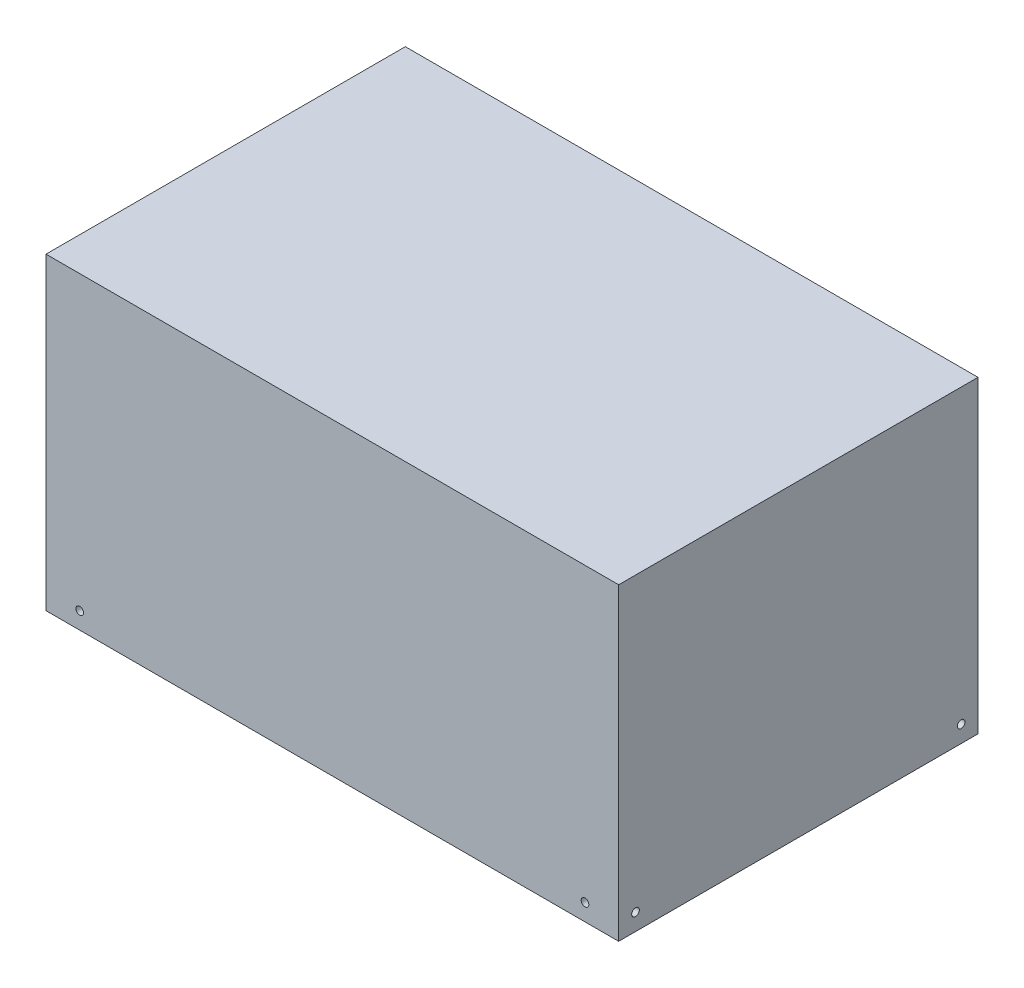
ISO-10303-21;
HEADER;
FILE_DESCRIPTION(('STEP AP214'),'2;1');
FILE_NAME('part.step','',(''),(''),'','','');
FILE_SCHEMA(('AUTOMOTIVE_DESIGN { 1 0 10303 214 1 1 1 1 }'));
ENDSEC;
DATA;
#1=APPLICATION_CONTEXT('core data for automotive mechanical design processes');
#2=APPLICATION_PROTOCOL_DEFINITION('international standard','automotive_design',2000,#1);
#3=PRODUCT_CONTEXT('',#1,'mechanical');
#4=PRODUCT('Part','Part','',(#3));
#5=PRODUCT_RELATED_PRODUCT_CATEGORY('part','',(#4));
#6=PRODUCT_DEFINITION_FORMATION('','',#4);
#7=PRODUCT_DEFINITION_CONTEXT('part definition',#1,'design');
#8=PRODUCT_DEFINITION('design','',#6,#7);
#9=PRODUCT_DEFINITION_SHAPE('','',#8);
#10=(LENGTH_UNIT() NAMED_UNIT(*) SI_UNIT(.MILLI.,.METRE.));
#11=(NAMED_UNIT(*) PLANE_ANGLE_UNIT() SI_UNIT($,.RADIAN.));
#12=(NAMED_UNIT(*) SI_UNIT($,.STERADIAN.) SOLID_ANGLE_UNIT());
#13=UNCERTAINTY_MEASURE_WITH_UNIT(LENGTH_MEASURE(1.E-05),#10,'distance_accuracy_value','');
#14=(GEOMETRIC_REPRESENTATION_CONTEXT(3) GLOBAL_UNCERTAINTY_ASSIGNED_CONTEXT((#13)) GLOBAL_UNIT_ASSIGNED_CONTEXT((#10,
#11,#12)) REPRESENTATION_CONTEXT('',''));
#15=CARTESIAN_POINT('',(0.,0.,0.));
#16=DIRECTION('',(0.,0.,1.));
#17=DIRECTION('',(1.,0.,0.));
#18=AXIS2_PLACEMENT_3D('',#15,#16,#17);
#19=CARTESIAN_POINT('',(255.,137.5,160.));
#20=DIRECTION('',(-1.,0.,0.));
#21=DIRECTION('',(0.,0.,1.));
#22=AXIS2_PLACEMENT_3D('',#19,#20,#21);
#23=PLANE('',#22);
#24=CARTESIAN_POINT('',(255.,-122.5,145.));
#25=DIRECTION('',(1.,0.,0.));
#26=DIRECTION('',(0.,0.,-1.));
#27=AXIS2_PLACEMENT_3D('',#24,#25,#26);
#28=CIRCLE('',#27,3.39999999999999);
#29=CARTESIAN_POINT('',(255.,-122.5,141.6));
#30=VERTEX_POINT('',#29);
#31=EDGE_CURVE('E128',#30,#30,#28,.T.);
#32=ORIENTED_EDGE('',*,*,#31,.F.);
#33=EDGE_LOOP('',(#32));
#34=FACE_BOUND('',#33,.T.);
#35=CARTESIAN_POINT('',(255.,-122.5,-145.));
#36=DIRECTION('',(1.,0.,0.));
#37=DIRECTION('',(0.,0.,-1.));
#38=AXIS2_PLACEMENT_3D('',#35,#36,#37);
#39=CIRCLE('',#38,3.39999999999999);
#40=CARTESIAN_POINT('',(255.,-122.5,-148.4));
#41=VERTEX_POINT('',#40);
#42=EDGE_CURVE('E134',#41,#41,#39,.T.);
#43=ORIENTED_EDGE('',*,*,#42,.F.);
#44=EDGE_LOOP('',(#43));
#45=FACE_BOUND('',#44,.T.);
#46=DIRECTION('',(0.,1.,0.));
#47=VECTOR('',#46,1.);
#48=CARTESIAN_POINT('',(255.,137.5,-160.));
#49=LINE('',#48,#47);
#50=CARTESIAN_POINT('',(255.,-137.5,-160.));
#51=VERTEX_POINT('',#50);
#52=CARTESIAN_POINT('',(255.,137.5,-160.));
#53=VERTEX_POINT('',#52);
#54=EDGE_CURVE('E152',#51,#53,#49,.T.);
#55=ORIENTED_EDGE('',*,*,#54,.T.);
#56=DIRECTION('',(0.,0.,-1.));
#57=VECTOR('',#56,1.);
#58=CARTESIAN_POINT('',(255.,137.5,160.));
#59=LINE('',#58,#57);
#60=CARTESIAN_POINT('',(255.,137.5,160.));
#61=VERTEX_POINT('',#60);
#62=EDGE_CURVE('E11',#61,#53,#59,.T.);
#63=ORIENTED_EDGE('',*,*,#62,.F.);
#64=DIRECTION('',(0.,1.,0.));
#65=VECTOR('',#64,1.);
#66=CARTESIAN_POINT('',(255.,137.5,160.));
#67=LINE('',#66,#65);
#68=CARTESIAN_POINT('',(255.,-137.5,160.));
#69=VERTEX_POINT('',#68);
#70=EDGE_CURVE('E153',#69,#61,#67,.T.);
#71=ORIENTED_EDGE('',*,*,#70,.F.);
#72=DIRECTION('',(0.,0.,-1.));
#73=VECTOR('',#72,1.);
#74=CARTESIAN_POINT('',(255.,-137.5,160.));
#75=LINE('',#74,#73);
#76=EDGE_CURVE('E159',#69,#51,#75,.T.);
#77=ORIENTED_EDGE('',*,*,#76,.T.);
#78=EDGE_LOOP('',(#55,#63,#71,#77));
#79=FACE_BOUND('',#78,.T.);
#80=ADVANCED_FACE('F41',(#34,#45,#79),#23,.F.);
#81=CARTESIAN_POINT('',(-255.,137.5,160.));
#82=DIRECTION('',(0.,-1.,0.));
#83=DIRECTION('',(0.,0.,-1.));
#84=AXIS2_PLACEMENT_3D('',#81,#82,#83);
#85=PLANE('',#84);
#86=DIRECTION('',(-1.,0.,0.));
#87=VECTOR('',#86,1.);
#88=CARTESIAN_POINT('',(-255.,137.5,-160.));
#89=LINE('',#88,#87);
#90=CARTESIAN_POINT('',(-255.,137.5,-160.));
#91=VERTEX_POINT('',#90);
#92=EDGE_CURVE('E162',#53,#91,#89,.T.);
#93=ORIENTED_EDGE('',*,*,#92,.T.);
#94=DIRECTION('',(0.,0.,-1.));
#95=VECTOR('',#94,1.);
#96=CARTESIAN_POINT('',(-255.,137.5,160.));
#97=LINE('',#96,#95);
#98=CARTESIAN_POINT('',(-255.,137.5,160.));
#99=VERTEX_POINT('',#98);
#100=EDGE_CURVE('E49',#99,#91,#97,.T.);
#101=ORIENTED_EDGE('',*,*,#100,.F.);
#102=DIRECTION('',(-1.,0.,0.));
#103=VECTOR('',#102,1.);
#104=CARTESIAN_POINT('',(-255.,137.5,160.));
#105=LINE('',#104,#103);
#106=EDGE_CURVE('E88',#61,#99,#105,.T.);
#107=ORIENTED_EDGE('',*,*,#106,.F.);
#108=ORIENTED_EDGE('',*,*,#62,.T.);
#109=EDGE_LOOP('',(#93,#101,#107,#108));
#110=FACE_BOUND('',#109,.T.);
#111=ADVANCED_FACE('F186',(#110),#85,.F.);
#112=CARTESIAN_POINT('',(-255.,137.5,160.));
#113=DIRECTION('',(1.,0.,0.));
#114=DIRECTION('',(0.,1.,0.));
#115=AXIS2_PLACEMENT_3D('',#112,#113,#114);
#116=PLANE('',#115);
#117=DIRECTION('',(0.,-1.,0.));
#118=VECTOR('',#117,1.);
#119=CARTESIAN_POINT('',(-255.,137.5,-160.));
#120=LINE('',#119,#118);
#121=CARTESIAN_POINT('',(-255.,-137.5,-160.));
#122=VERTEX_POINT('',#121);
#123=EDGE_CURVE('E75',#91,#122,#120,.T.);
#124=ORIENTED_EDGE('',*,*,#123,.T.);
#125=DIRECTION('',(0.,0.,-1.));
#126=VECTOR('',#125,1.);
#127=CARTESIAN_POINT('',(-255.,-137.5,160.));
#128=LINE('',#127,#126);
#129=CARTESIAN_POINT('',(-255.,-137.5,160.));
#130=VERTEX_POINT('',#129);
#131=EDGE_CURVE('E167',#130,#122,#128,.T.);
#132=ORIENTED_EDGE('',*,*,#131,.F.);
#133=DIRECTION('',(0.,-1.,0.));
#134=VECTOR('',#133,1.);
#135=CARTESIAN_POINT('',(-255.,137.5,160.));
#136=LINE('',#135,#134);
#137=EDGE_CURVE('E156',#99,#130,#136,.T.);
#138=ORIENTED_EDGE('',*,*,#137,.F.);
#139=ORIENTED_EDGE('',*,*,#100,.T.);
#140=EDGE_LOOP('',(#124,#132,#138,#139));
#141=FACE_BOUND('',#140,.T.);
#142=ADVANCED_FACE('F169',(#141),#116,.F.);
#143=CARTESIAN_POINT('',(-255.,-137.5,160.));
#144=DIRECTION('',(0.,1.,0.));
#145=DIRECTION('',(0.,0.,1.));
#146=AXIS2_PLACEMENT_3D('',#143,#144,#145);
#147=PLANE('',#146);
#148=DIRECTION('',(1.,0.,0.));
#149=VECTOR('',#148,1.);
#150=CARTESIAN_POINT('',(-255.,-137.5,-160.));
#151=LINE('',#150,#149);
#152=EDGE_CURVE('E81',#122,#51,#151,.T.);
#153=ORIENTED_EDGE('',*,*,#152,.T.);
#154=ORIENTED_EDGE('',*,*,#76,.F.);
#155=DIRECTION('',(1.,0.,0.));
#156=VECTOR('',#155,1.);
#157=CARTESIAN_POINT('',(-255.,-137.5,160.));
#158=LINE('',#157,#156);
#159=EDGE_CURVE('E57',#130,#69,#158,.T.);
#160=ORIENTED_EDGE('',*,*,#159,.F.);
#161=ORIENTED_EDGE('',*,*,#131,.T.);
#162=EDGE_LOOP('',(#153,#154,#160,#161));
#163=FACE_BOUND('',#162,.T.);
#164=ADVANCED_FACE('F176',(#163),#147,.F.);
#165=CARTESIAN_POINT('',(0.,0.,160.));
#166=DIRECTION('',(0.,0.,1.));
#167=DIRECTION('',(1.,0.,0.));
#168=AXIS2_PLACEMENT_3D('',#165,#166,#167);
#169=PLANE('',#168);
#170=CARTESIAN_POINT('',(225.,-122.5,160.));
#171=DIRECTION('',(0.,0.,1.));
#172=DIRECTION('',(1.,0.,0.));
#173=AXIS2_PLACEMENT_3D('',#170,#171,#172);
#174=CIRCLE('',#173,3.39999999999999);
#175=CARTESIAN_POINT('',(228.4,-122.5,160.));
#176=VERTEX_POINT('',#175);
#177=EDGE_CURVE('E140',#176,#176,#174,.T.);
#178=ORIENTED_EDGE('',*,*,#177,.F.);
#179=EDGE_LOOP('',(#178));
#180=FACE_BOUND('',#179,.T.);
#181=CARTESIAN_POINT('',(-225.,-122.5,160.));
#182=DIRECTION('',(0.,0.,1.));
#183=DIRECTION('',(1.,0.,0.));
#184=AXIS2_PLACEMENT_3D('',#181,#182,#183);
#185=CIRCLE('',#184,3.39999999999999);
#186=CARTESIAN_POINT('',(-221.6,-122.5,160.));
#187=VERTEX_POINT('',#186);
#188=EDGE_CURVE('E146',#187,#187,#185,.T.);
#189=ORIENTED_EDGE('',*,*,#188,.F.);
#190=EDGE_LOOP('',(#189));
#191=FACE_BOUND('',#190,.T.);
#192=ORIENTED_EDGE('',*,*,#70,.T.);
#193=ORIENTED_EDGE('',*,*,#106,.T.);
#194=ORIENTED_EDGE('',*,*,#137,.T.);
#195=ORIENTED_EDGE('',*,*,#159,.T.);
#196=EDGE_LOOP('',(#192,#193,#194,#195));
#197=FACE_BOUND('',#196,.T.);
#198=ADVANCED_FACE('F178',(#180,#191,#197),#169,.T.);
#199=CARTESIAN_POINT('',(0.,0.,-160.));
#200=DIRECTION('',(0.,0.,1.));
#201=DIRECTION('',(1.,0.,0.));
#202=AXIS2_PLACEMENT_3D('',#199,#200,#201);
#203=PLANE('',#202);
#204=CARTESIAN_POINT('',(225.,-122.5,-160.));
#205=DIRECTION('',(0.,0.,-1.));
#206=DIRECTION('',(-1.,0.,0.));
#207=AXIS2_PLACEMENT_3D('',#204,#205,#206);
#208=CIRCLE('',#207,3.39999999999999);
#209=CARTESIAN_POINT('',(221.6,-122.5,-160.));
#210=VERTEX_POINT('',#209);
#211=EDGE_CURVE('E118',#210,#210,#208,.T.);
#212=ORIENTED_EDGE('',*,*,#211,.F.);
#213=EDGE_LOOP('',(#212));
#214=FACE_BOUND('',#213,.T.);
#215=CARTESIAN_POINT('',(-225.,-122.5,-160.));
#216=DIRECTION('',(0.,0.,-1.));
#217=DIRECTION('',(-1.,0.,0.));
#218=AXIS2_PLACEMENT_3D('',#215,#216,#217);
#219=CIRCLE('',#218,3.39999999999999);
#220=CARTESIAN_POINT('',(-228.4,-122.5,-160.));
#221=VERTEX_POINT('',#220);
#222=EDGE_CURVE('E117',#221,#221,#219,.T.);
#223=ORIENTED_EDGE('',*,*,#222,.F.);
#224=EDGE_LOOP('',(#223));
#225=FACE_BOUND('',#224,.T.);
#226=ORIENTED_EDGE('',*,*,#54,.F.);
#227=ORIENTED_EDGE('',*,*,#152,.F.);
#228=ORIENTED_EDGE('',*,*,#123,.F.);
#229=ORIENTED_EDGE('',*,*,#92,.F.);
#230=EDGE_LOOP('',(#226,#227,#228,#229));
#231=FACE_BOUND('',#230,.T.);
#232=ADVANCED_FACE('F172',(#214,#225,#231),#203,.F.);
#233=CARTESIAN_POINT('',(-225.,-122.5,151.75));
#234=DIRECTION('',(0.,0.,1.));
#235=DIRECTION('',(1.,0.,0.));
#236=AXIS2_PLACEMENT_3D('',#233,#234,#235);
#237=CONICAL_SURFACE('',#236,3.39999999999999,1.02974425867665);
#238=CARTESIAN_POINT('',(-225.,-122.5,149.707073895306));
#239=VERTEX_POINT('',#238);
#240=VERTEX_LOOP('',#239);
#241=FACE_BOUND('',#240,.T.);
#242=CARTESIAN_POINT('',(-225.,-122.5,151.75));
#243=DIRECTION('',(0.,0.,1.));
#244=DIRECTION('',(1.,0.,0.));
#245=AXIS2_PLACEMENT_3D('',#242,#243,#244);
#246=CIRCLE('',#245,3.39999999999999);
#247=CARTESIAN_POINT('',(-221.6,-122.5,151.75));
#248=VERTEX_POINT('',#247);
#249=EDGE_CURVE('E149',#248,#248,#246,.T.);
#250=ORIENTED_EDGE('',*,*,#249,.T.);
#251=EDGE_LOOP('',(#250));
#252=FACE_BOUND('',#251,.T.);
#253=ADVANCED_FACE('F227',(#241,#252),#237,.F.);
#254=CARTESIAN_POINT('',(-225.,-122.5,160.));
#255=DIRECTION('',(0.,0.,1.));
#256=DIRECTION('',(1.,0.,0.));
#257=AXIS2_PLACEMENT_3D('',#254,#255,#256);
#258=CYLINDRICAL_SURFACE('',#257,3.39999999999999);
#259=ORIENTED_EDGE('',*,*,#249,.F.);
#260=EDGE_LOOP('',(#259));
#261=FACE_BOUND('',#260,.T.);
#262=ORIENTED_EDGE('',*,*,#188,.T.);
#263=EDGE_LOOP('',(#262));
#264=FACE_BOUND('',#263,.T.);
#265=ADVANCED_FACE('F223',(#261,#264),#258,.F.);
#266=CARTESIAN_POINT('',(225.,-122.5,151.75));
#267=DIRECTION('',(0.,0.,1.));
#268=DIRECTION('',(1.,0.,0.));
#269=AXIS2_PLACEMENT_3D('',#266,#267,#268);
#270=CONICAL_SURFACE('',#269,3.39999999999999,1.02974425867665);
#271=CARTESIAN_POINT('',(225.,-122.5,149.707073895306));
#272=VERTEX_POINT('',#271);
#273=VERTEX_LOOP('',#272);
#274=FACE_BOUND('',#273,.T.);
#275=CARTESIAN_POINT('',(225.,-122.5,151.75));
#276=DIRECTION('',(0.,0.,1.));
#277=DIRECTION('',(1.,0.,0.));
#278=AXIS2_PLACEMENT_3D('',#275,#276,#277);
#279=CIRCLE('',#278,3.39999999999999);
#280=CARTESIAN_POINT('',(228.4,-122.5,151.75));
#281=VERTEX_POINT('',#280);
#282=EDGE_CURVE('E143',#281,#281,#279,.T.);
#283=ORIENTED_EDGE('',*,*,#282,.T.);
#284=EDGE_LOOP('',(#283));
#285=FACE_BOUND('',#284,.T.);
#286=ADVANCED_FACE('F219',(#274,#285),#270,.F.);
#287=CARTESIAN_POINT('',(225.,-122.5,160.));
#288=DIRECTION('',(0.,0.,1.));
#289=DIRECTION('',(1.,0.,0.));
#290=AXIS2_PLACEMENT_3D('',#287,#288,#289);
#291=CYLINDRICAL_SURFACE('',#290,3.39999999999999);
#292=ORIENTED_EDGE('',*,*,#282,.F.);
#293=EDGE_LOOP('',(#292));
#294=FACE_BOUND('',#293,.T.);
#295=ORIENTED_EDGE('',*,*,#177,.T.);
#296=EDGE_LOOP('',(#295));
#297=FACE_BOUND('',#296,.T.);
#298=ADVANCED_FACE('F211',(#294,#297),#291,.F.);
#299=CARTESIAN_POINT('',(246.75,-122.5,-145.));
#300=DIRECTION('',(1.,0.,0.));
#301=DIRECTION('',(0.,0.,-1.));
#302=AXIS2_PLACEMENT_3D('',#299,#300,#301);
#303=CONICAL_SURFACE('',#302,3.39999999999999,1.02974425867665);
#304=CARTESIAN_POINT('',(244.707073895306,-122.5,-145.));
#305=VERTEX_POINT('',#304);
#306=VERTEX_LOOP('',#305);
#307=FACE_BOUND('',#306,.T.);
#308=CARTESIAN_POINT('',(246.75,-122.5,-145.));
#309=DIRECTION('',(1.,0.,0.));
#310=DIRECTION('',(0.,0.,-1.));
#311=AXIS2_PLACEMENT_3D('',#308,#309,#310);
#312=CIRCLE('',#311,3.39999999999999);
#313=CARTESIAN_POINT('',(246.75,-122.5,-148.4));
#314=VERTEX_POINT('',#313);
#315=EDGE_CURVE('E137',#314,#314,#312,.T.);
#316=ORIENTED_EDGE('',*,*,#315,.T.);
#317=EDGE_LOOP('',(#316));
#318=FACE_BOUND('',#317,.T.);
#319=ADVANCED_FACE('F201',(#307,#318),#303,.F.);
#320=CARTESIAN_POINT('',(255.,-122.5,-145.));
#321=DIRECTION('',(1.,0.,0.));
#322=DIRECTION('',(0.,0.,-1.));
#323=AXIS2_PLACEMENT_3D('',#320,#321,#322);
#324=CYLINDRICAL_SURFACE('',#323,3.39999999999999);
#325=ORIENTED_EDGE('',*,*,#315,.F.);
#326=EDGE_LOOP('',(#325));
#327=FACE_BOUND('',#326,.T.);
#328=ORIENTED_EDGE('',*,*,#42,.T.);
#329=EDGE_LOOP('',(#328));
#330=FACE_BOUND('',#329,.T.);
#331=ADVANCED_FACE('F198',(#327,#330),#324,.F.);
#332=CARTESIAN_POINT('',(246.75,-122.5,145.));
#333=DIRECTION('',(1.,0.,0.));
#334=DIRECTION('',(0.,0.,-1.));
#335=AXIS2_PLACEMENT_3D('',#332,#333,#334);
#336=CONICAL_SURFACE('',#335,3.39999999999999,1.02974425867665);
#337=CARTESIAN_POINT('',(244.707073895306,-122.5,145.));
#338=VERTEX_POINT('',#337);
#339=VERTEX_LOOP('',#338);
#340=FACE_BOUND('',#339,.T.);
#341=CARTESIAN_POINT('',(246.75,-122.5,145.));
#342=DIRECTION('',(1.,0.,0.));
#343=DIRECTION('',(0.,0.,-1.));
#344=AXIS2_PLACEMENT_3D('',#341,#342,#343);
#345=CIRCLE('',#344,3.39999999999999);
#346=CARTESIAN_POINT('',(246.75,-122.5,141.6));
#347=VERTEX_POINT('',#346);
#348=EDGE_CURVE('E131',#347,#347,#345,.T.);
#349=ORIENTED_EDGE('',*,*,#348,.T.);
#350=EDGE_LOOP('',(#349));
#351=FACE_BOUND('',#350,.T.);
#352=ADVANCED_FACE('F200',(#340,#351),#336,.F.);
#353=CARTESIAN_POINT('',(255.,-122.5,145.));
#354=DIRECTION('',(1.,0.,0.));
#355=DIRECTION('',(0.,0.,-1.));
#356=AXIS2_PLACEMENT_3D('',#353,#354,#355);
#357=CYLINDRICAL_SURFACE('',#356,3.39999999999999);
#358=ORIENTED_EDGE('',*,*,#348,.F.);
#359=EDGE_LOOP('',(#358));
#360=FACE_BOUND('',#359,.T.);
#361=ORIENTED_EDGE('',*,*,#31,.T.);
#362=EDGE_LOOP('',(#361));
#363=FACE_BOUND('',#362,.T.);
#364=ADVANCED_FACE('F208',(#360,#363),#357,.F.);
#365=CARTESIAN_POINT('',(-225.,-122.5,-151.75));
#366=DIRECTION('',(0.,0.,-1.));
#367=DIRECTION('',(-1.,0.,0.));
#368=AXIS2_PLACEMENT_3D('',#365,#366,#367);
#369=CONICAL_SURFACE('',#368,3.39999999999999,1.02974425867665);
#370=CARTESIAN_POINT('',(-225.,-122.5,-149.707073895306));
#371=VERTEX_POINT('',#370);
#372=VERTEX_LOOP('',#371);
#373=FACE_BOUND('',#372,.T.);
#374=CARTESIAN_POINT('',(-225.,-122.5,-151.75));
#375=DIRECTION('',(0.,0.,-1.));
#376=DIRECTION('',(-1.,0.,0.));
#377=AXIS2_PLACEMENT_3D('',#374,#375,#376);
#378=CIRCLE('',#377,3.39999999999999);
#379=CARTESIAN_POINT('',(-228.4,-122.5,-151.75));
#380=VERTEX_POINT('',#379);
#381=EDGE_CURVE('E121',#380,#380,#378,.T.);
#382=ORIENTED_EDGE('',*,*,#381,.T.);
#383=EDGE_LOOP('',(#382));
#384=FACE_BOUND('',#383,.T.);
#385=ADVANCED_FACE('F240',(#373,#384),#369,.F.);
#386=CARTESIAN_POINT('',(-225.,-122.5,-160.));
#387=DIRECTION('',(0.,0.,-1.));
#388=DIRECTION('',(-1.,0.,0.));
#389=AXIS2_PLACEMENT_3D('',#386,#387,#388);
#390=CYLINDRICAL_SURFACE('',#389,3.39999999999999);
#391=ORIENTED_EDGE('',*,*,#381,.F.);
#392=EDGE_LOOP('',(#391));
#393=FACE_BOUND('',#392,.T.);
#394=ORIENTED_EDGE('',*,*,#222,.T.);
#395=EDGE_LOOP('',(#394));
#396=FACE_BOUND('',#395,.T.);
#397=ADVANCED_FACE('F111',(#393,#396),#390,.F.);
#398=CARTESIAN_POINT('',(225.,-122.5,-151.75));
#399=DIRECTION('',(0.,0.,-1.));
#400=DIRECTION('',(-1.,0.,0.));
#401=AXIS2_PLACEMENT_3D('',#398,#399,#400);
#402=CONICAL_SURFACE('',#401,3.39999999999999,1.02974425867665);
#403=CARTESIAN_POINT('',(225.,-122.5,-149.707073895306));
#404=VERTEX_POINT('',#403);
#405=VERTEX_LOOP('',#404);
#406=FACE_BOUND('',#405,.T.);
#407=CARTESIAN_POINT('',(225.,-122.5,-151.75));
#408=DIRECTION('',(0.,0.,-1.));
#409=DIRECTION('',(-1.,0.,0.));
#410=AXIS2_PLACEMENT_3D('',#407,#408,#409);
#411=CIRCLE('',#410,3.39999999999999);
#412=CARTESIAN_POINT('',(221.6,-122.5,-151.75));
#413=VERTEX_POINT('',#412);
#414=EDGE_CURVE('E115',#413,#413,#411,.T.);
#415=ORIENTED_EDGE('',*,*,#414,.T.);
#416=EDGE_LOOP('',(#415));
#417=FACE_BOUND('',#416,.T.);
#418=ADVANCED_FACE('F107',(#406,#417),#402,.F.);
#419=CARTESIAN_POINT('',(225.,-122.5,-160.));
#420=DIRECTION('',(0.,0.,-1.));
#421=DIRECTION('',(-1.,0.,0.));
#422=AXIS2_PLACEMENT_3D('',#419,#420,#421);
#423=CYLINDRICAL_SURFACE('',#422,3.39999999999999);
#424=ORIENTED_EDGE('',*,*,#414,.F.);
#425=EDGE_LOOP('',(#424));
#426=FACE_BOUND('',#425,.T.);
#427=ORIENTED_EDGE('',*,*,#211,.T.);
#428=EDGE_LOOP('',(#427));
#429=FACE_BOUND('',#428,.T.);
#430=ADVANCED_FACE('F110',(#426,#429),#423,.F.);
#431=CLOSED_SHELL('',(#80,#111,#142,#164,#198,#232,#253,#265,#286,#298,#319,#331,#352,#364,#385,
#397,#418,#430));
#432=MANIFOLD_SOLID_BREP('B2',#431);
#433=ADVANCED_BREP_SHAPE_REPRESENTATION('',(#18,#432),#14);
#434=SHAPE_DEFINITION_REPRESENTATION(#9,#433);
ENDSEC;
END-ISO-10303-21;
